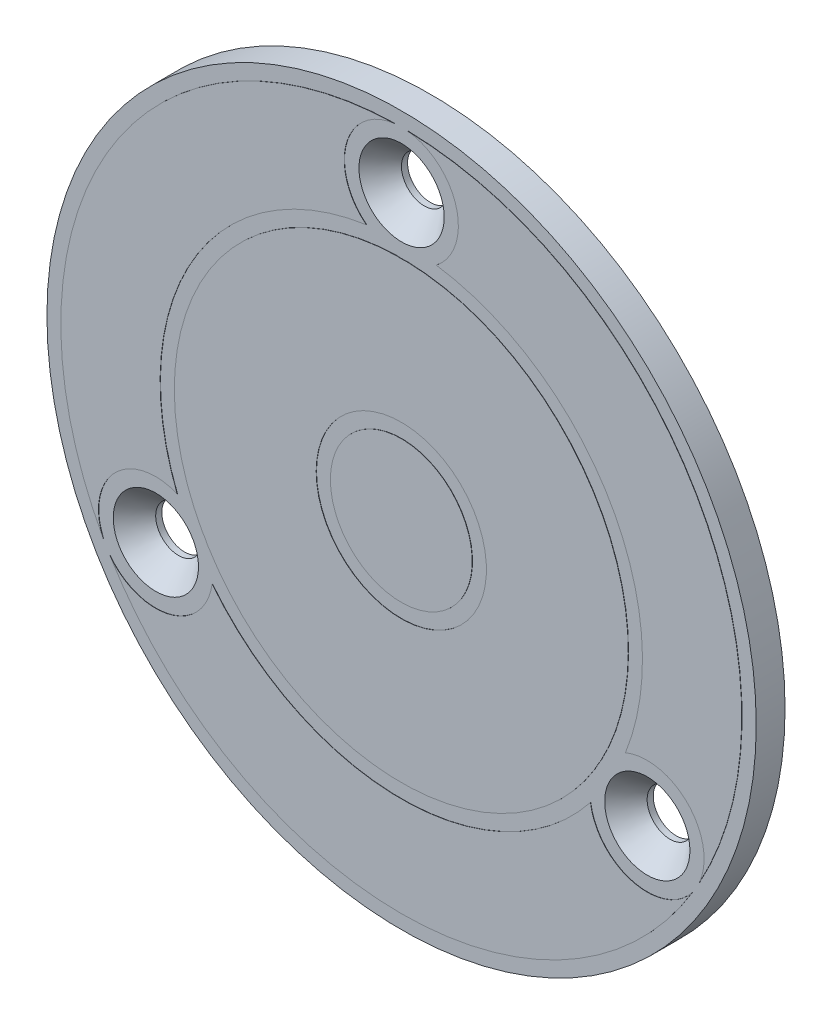
ISO-10303-21;
HEADER;
FILE_DESCRIPTION(('STEP AP214'),'2;1');
FILE_NAME('part.step','',(''),(''),'','','');
FILE_SCHEMA(('AUTOMOTIVE_DESIGN { 1 0 10303 214 1 1 1 1 }'));
ENDSEC;
DATA;
#1=APPLICATION_CONTEXT('core data for automotive mechanical design processes');
#2=APPLICATION_PROTOCOL_DEFINITION('international standard','automotive_design',2000,#1);
#3=PRODUCT_CONTEXT('',#1,'mechanical');
#4=PRODUCT('Part','Part','',(#3));
#5=PRODUCT_RELATED_PRODUCT_CATEGORY('part','',(#4));
#6=PRODUCT_DEFINITION_FORMATION('','',#4);
#7=PRODUCT_DEFINITION_CONTEXT('part definition',#1,'design');
#8=PRODUCT_DEFINITION('design','',#6,#7);
#9=PRODUCT_DEFINITION_SHAPE('','',#8);
#10=(LENGTH_UNIT() NAMED_UNIT(*) SI_UNIT(.MILLI.,.METRE.));
#11=(NAMED_UNIT(*) PLANE_ANGLE_UNIT() SI_UNIT($,.RADIAN.));
#12=(NAMED_UNIT(*) SI_UNIT($,.STERADIAN.) SOLID_ANGLE_UNIT());
#13=UNCERTAINTY_MEASURE_WITH_UNIT(LENGTH_MEASURE(1.E-05),#10,'distance_accuracy_value','');
#14=(GEOMETRIC_REPRESENTATION_CONTEXT(3) GLOBAL_UNCERTAINTY_ASSIGNED_CONTEXT((#13)) GLOBAL_UNIT_ASSIGNED_CONTEXT((#10,
#11,#12)) REPRESENTATION_CONTEXT('',''));
#15=CARTESIAN_POINT('',(0.,0.,0.));
#16=DIRECTION('',(0.,0.,1.));
#17=DIRECTION('',(1.,0.,0.));
#18=AXIS2_PLACEMENT_3D('',#15,#16,#17);
#19=CARTESIAN_POINT('',(0.,0.,1.026));
#20=DIRECTION('',(0.,0.,-1.));
#21=DIRECTION('',(-1.,0.,0.));
#22=AXIS2_PLACEMENT_3D('',#19,#20,#21);
#23=CYLINDRICAL_SURFACE('',#22,12.);
#24=CARTESIAN_POINT('',(0.,0.,1.016));
#25=DIRECTION('',(0.,0.,1.));
#26=DIRECTION('',(1.,0.,0.));
#27=AXIS2_PLACEMENT_3D('',#24,#25,#26);
#28=CIRCLE('',#27,12.);
#29=CARTESIAN_POINT('',(-10.27373582598,-6.20083479686212,1.016));
#30=VERTEX_POINT('',#29);
#31=CARTESIAN_POINT('',(10.2737358259801,-6.20083479686195,1.016));
#32=VERTEX_POINT('',#31);
#33=EDGE_CURVE('E207',#30,#32,#28,.T.);
#34=ORIENTED_EDGE('',*,*,#33,.T.);
#35=DIRECTION('',(0.,0.,1.));
#36=VECTOR('',#35,1.);
#37=CARTESIAN_POINT('',(10.27373582598,-6.20083479686203,1.021));
#38=LINE('',#37,#36);
#39=CARTESIAN_POINT('',(10.27373582598,-6.20083479686203,1.026));
#40=VERTEX_POINT('',#39);
#41=EDGE_CURVE('E200',#32,#40,#38,.T.);
#42=ORIENTED_EDGE('',*,*,#41,.T.);
#43=CARTESIAN_POINT('',(0.,0.,1.026));
#44=DIRECTION('',(0.,0.,1.));
#45=DIRECTION('',(1.,0.,0.));
#46=AXIS2_PLACEMENT_3D('',#43,#44,#45);
#47=CIRCLE('',#46,12.);
#48=CARTESIAN_POINT('',(-10.2737358259799,-6.20083479686217,1.026));
#49=VERTEX_POINT('',#48);
#50=EDGE_CURVE('E238',#49,#40,#47,.T.);
#51=ORIENTED_EDGE('',*,*,#50,.F.);
#52=DIRECTION('',(0.,0.,1.));
#53=VECTOR('',#52,1.);
#54=CARTESIAN_POINT('',(-10.2737358259799,-6.20083479686217,1.021));
#55=LINE('',#54,#53);
#56=EDGE_CURVE('E365',#49,#30,#55,.F.);
#57=ORIENTED_EDGE('',*,*,#56,.T.);
#58=EDGE_LOOP('',(#34,#42,#51,#57));
#59=FACE_BOUND('',#58,.T.);
#60=ADVANCED_FACE('F54',(#59),#23,.T.);
#61=CARTESIAN_POINT('',(0.,-27.6414213562373,1.026));
#62=DIRECTION('',(0.,0.,1.));
#63=DIRECTION('',(1.,0.,0.));
#64=AXIS2_PLACEMENT_3D('',#61,#62,#63);
#65=PLANE('',#64);
#66=CARTESIAN_POINT('',(8.66025403784443,-4.99999999999992,1.026));
#67=DIRECTION('',(0.,0.,1.));
#68=DIRECTION('',(1.,0.,0.));
#69=AXIS2_PLACEMENT_3D('',#66,#67,#68);
#70=CIRCLE('',#69,2.0113);
#71=CARTESIAN_POINT('',(6.66744622877975,-5.27211160601999,1.026));
#72=VERTEX_POINT('',#71);
#73=EDGE_CURVE('E377',#72,#40,#70,.T.);
#74=ORIENTED_EDGE('',*,*,#73,.F.);
#75=CARTESIAN_POINT('',(0.,0.,1.026));
#76=DIRECTION('',(0.,0.,1.));
#77=DIRECTION('',(1.,0.,0.));
#78=AXIS2_PLACEMENT_3D('',#75,#76,#77);
#79=CIRCLE('',#78,8.5);
#80=CARTESIAN_POINT('',(-6.66744622877968,-5.27211160602008,1.026));
#81=VERTEX_POINT('',#80);
#82=EDGE_CURVE('E224',#81,#72,#79,.T.);
#83=ORIENTED_EDGE('',*,*,#82,.F.);
#84=CARTESIAN_POINT('',(-8.66025403784437,-5.00000000000004,1.026));
#85=DIRECTION('',(0.,0.,1.));
#86=DIRECTION('',(1.,0.,0.));
#87=AXIS2_PLACEMENT_3D('',#84,#85,#86);
#88=CIRCLE('',#87,2.0113);
#89=EDGE_CURVE('E356',#49,#81,#88,.T.);
#90=ORIENTED_EDGE('',*,*,#89,.F.);
#91=ORIENTED_EDGE('',*,*,#50,.T.);
#92=EDGE_LOOP('',(#74,#83,#90,#91));
#93=FACE_BOUND('',#92,.T.);
#94=ADVANCED_FACE('F404',(#93),#65,.T.);
#95=CARTESIAN_POINT('',(0.,0.,1.026));
#96=DIRECTION('',(0.,0.,-1.));
#97=DIRECTION('',(-1.,0.,0.));
#98=AXIS2_PLACEMENT_3D('',#95,#96,#97);
#99=CYLINDRICAL_SURFACE('',#98,8.);
#100=CARTESIAN_POINT('',(0.,0.,1.016));
#101=DIRECTION('',(0.,0.,1.));
#102=DIRECTION('',(1.,0.,0.));
#103=AXIS2_PLACEMENT_3D('',#100,#101,#102);
#104=CIRCLE('',#103,8.);
#105=CARTESIAN_POINT('',(-6.8310341085416,-4.16376908676997,1.016));
#106=VERTEX_POINT('',#105);
#107=CARTESIAN_POINT('',(6.83103410854166,-4.16376908676987,1.016));
#108=VERTEX_POINT('',#107);
#109=EDGE_CURVE('E328',#106,#108,#104,.T.);
#110=ORIENTED_EDGE('',*,*,#109,.T.);
#111=DIRECTION('',(0.,0.,1.));
#112=VECTOR('',#111,1.);
#113=CARTESIAN_POINT('',(6.83103410854165,-4.16376908676989,1.021));
#114=LINE('',#113,#112);
#115=CARTESIAN_POINT('',(6.83103410854165,-4.16376908676989,1.026));
#116=VERTEX_POINT('',#115);
#117=EDGE_CURVE('E201',#108,#116,#114,.T.);
#118=ORIENTED_EDGE('',*,*,#117,.T.);
#119=CARTESIAN_POINT('',(0.,0.,1.026));
#120=DIRECTION('',(0.,0.,1.));
#121=DIRECTION('',(1.,0.,0.));
#122=AXIS2_PLACEMENT_3D('',#119,#120,#121);
#123=CIRCLE('',#122,8.);
#124=CARTESIAN_POINT('',(-6.83103410854163,-4.16376908676993,1.026));
#125=VERTEX_POINT('',#124);
#126=EDGE_CURVE('E213',#125,#116,#123,.T.);
#127=ORIENTED_EDGE('',*,*,#126,.F.);
#128=DIRECTION('',(0.,0.,1.));
#129=VECTOR('',#128,1.);
#130=CARTESIAN_POINT('',(-6.83103410854163,-4.16376908676992,1.021));
#131=LINE('',#130,#129);
#132=EDGE_CURVE('E77',#125,#106,#131,.F.);
#133=ORIENTED_EDGE('',*,*,#132,.T.);
#134=EDGE_LOOP('',(#110,#118,#127,#133));
#135=FACE_BOUND('',#134,.T.);
#136=ADVANCED_FACE('F383',(#135),#99,.T.);
#137=CARTESIAN_POINT('',(8.66025403784443,-4.99999999999992,1.026));
#138=DIRECTION('',(0.,0.,1.));
#139=DIRECTION('',(1.,0.,0.));
#140=AXIS2_PLACEMENT_3D('',#137,#138,#139);
#141=CONICAL_SURFACE('',#140,1.5113,0.715584993317674);
#142=CARTESIAN_POINT('',(8.66025403784443,-4.99999999999992,0.215162828170269));
#143=DIRECTION('',(0.,0.,1.));
#144=DIRECTION('',(1.,0.,0.));
#145=AXIS2_PLACEMENT_3D('',#142,#143,#144);
#146=CIRCLE('',#145,0.80645);
#147=CARTESIAN_POINT('',(9.46670403784443,-4.99999999999992,0.215162828170269));
#148=VERTEX_POINT('',#147);
#149=EDGE_CURVE('E290',#148,#148,#146,.T.);
#150=ORIENTED_EDGE('',*,*,#149,.F.);
#151=EDGE_LOOP('',(#150));
#152=FACE_BOUND('',#151,.T.);
#153=CARTESIAN_POINT('',(8.66025403784443,-4.99999999999992,1.016));
#154=DIRECTION('',(0.,0.,1.));
#155=DIRECTION('',(1.,0.,0.));
#156=AXIS2_PLACEMENT_3D('',#153,#154,#155);
#157=CIRCLE('',#156,1.50260713262184);
#158=CARTESIAN_POINT('',(10.1628611704663,-4.99999999999992,1.016));
#159=VERTEX_POINT('',#158);
#160=EDGE_CURVE('E296',#159,#159,#157,.T.);
#161=ORIENTED_EDGE('',*,*,#160,.T.);
#162=EDGE_LOOP('',(#161));
#163=FACE_BOUND('',#162,.T.);
#164=ADVANCED_FACE('F416',(#152,#163),#141,.F.);
#165=CARTESIAN_POINT('',(-0.233212545763079,11.9977336155,1.016));
#166=VERTEX_POINT('',#165);
#167=CARTESIAN_POINT('',(-10.506948371743,-5.79689881863798,1.016));
#168=VERTEX_POINT('',#167);
#169=EDGE_CURVE('E210',#166,#168,#28,.T.);
#170=ORIENTED_EDGE('',*,*,#169,.T.);
#171=DIRECTION('',(0.,0.,1.));
#172=VECTOR('',#171,1.);
#173=CARTESIAN_POINT('',(-10.5069483717431,-5.79689881863792,1.021));
#174=LINE('',#173,#172);
#175=CARTESIAN_POINT('',(-10.5069483717431,-5.79689881863792,1.026));
#176=VERTEX_POINT('',#175);
#177=EDGE_CURVE('E369',#168,#176,#174,.T.);
#178=ORIENTED_EDGE('',*,*,#177,.T.);
#179=CARTESIAN_POINT('',(-0.233212545763147,11.9977336155,1.026));
#180=VERTEX_POINT('',#179);
#181=EDGE_CURVE('E239',#180,#176,#47,.T.);
#182=ORIENTED_EDGE('',*,*,#181,.F.);
#183=DIRECTION('',(0.,0.,1.));
#184=VECTOR('',#183,1.);
#185=CARTESIAN_POINT('',(-0.233212545763147,11.9977336155,1.021));
#186=LINE('',#185,#184);
#187=EDGE_CURVE('E286',#180,#166,#186,.F.);
#188=ORIENTED_EDGE('',*,*,#187,.T.);
#189=EDGE_LOOP('',(#170,#178,#182,#188));
#190=FACE_BOUND('',#189,.T.);
#191=ADVANCED_FACE('F407',(#190),#23,.T.);
#192=CARTESIAN_POINT('',(-7.89950569678997,-3.13812200947999,1.026));
#193=VERTEX_POINT('',#192);
#194=EDGE_CURVE('E354',#193,#176,#88,.T.);
#195=ORIENTED_EDGE('',*,*,#194,.F.);
#196=CARTESIAN_POINT('',(-1.23205946801029,8.4102336155,1.026));
#197=VERTEX_POINT('',#196);
#198=EDGE_CURVE('E226',#197,#193,#79,.T.);
#199=ORIENTED_EDGE('',*,*,#198,.F.);
#200=CARTESIAN_POINT('',(0.,10.,1.026));
#201=DIRECTION('',(0.,0.,1.));
#202=DIRECTION('',(1.,0.,0.));
#203=AXIS2_PLACEMENT_3D('',#200,#201,#202);
#204=CIRCLE('',#203,2.0113);
#205=EDGE_CURVE('E269',#180,#197,#204,.T.);
#206=ORIENTED_EDGE('',*,*,#205,.F.);
#207=ORIENTED_EDGE('',*,*,#181,.T.);
#208=EDGE_LOOP('',(#195,#199,#206,#207));
#209=FACE_BOUND('',#208,.T.);
#210=ADVANCED_FACE('F413',(#209),#65,.T.);
#211=CARTESIAN_POINT('',(-0.190412750364309,7.9977336155,1.016));
#212=VERTEX_POINT('',#211);
#213=CARTESIAN_POINT('',(-7.0214468589059,-3.83396452873009,1.016));
#214=VERTEX_POINT('',#213);
#215=EDGE_CURVE('E326',#212,#214,#104,.T.);
#216=ORIENTED_EDGE('',*,*,#215,.T.);
#217=DIRECTION('',(0.,0.,1.));
#218=VECTOR('',#217,1.);
#219=CARTESIAN_POINT('',(-7.02144685890586,-3.83396452873014,1.021));
#220=LINE('',#219,#218);
#221=CARTESIAN_POINT('',(-7.02144685890586,-3.83396452873014,1.026));
#222=VERTEX_POINT('',#221);
#223=EDGE_CURVE('E362',#214,#222,#220,.T.);
#224=ORIENTED_EDGE('',*,*,#223,.T.);
#225=CARTESIAN_POINT('',(-0.190412750364307,7.9977336155,1.026));
#226=VERTEX_POINT('',#225);
#227=EDGE_CURVE('E208',#226,#222,#123,.T.);
#228=ORIENTED_EDGE('',*,*,#227,.F.);
#229=DIRECTION('',(0.,0.,1.));
#230=VECTOR('',#229,1.);
#231=CARTESIAN_POINT('',(-0.190412750364307,7.9977336155,1.021));
#232=LINE('',#231,#230);
#233=EDGE_CURVE('E276',#226,#212,#232,.F.);
#234=ORIENTED_EDGE('',*,*,#233,.T.);
#235=EDGE_LOOP('',(#216,#224,#228,#234));
#236=FACE_BOUND('',#235,.T.);
#237=ADVANCED_FACE('F388',(#236),#99,.T.);
#238=CARTESIAN_POINT('',(-8.66025403784437,-5.00000000000004,1.026));
#239=DIRECTION('',(0.,0.,1.));
#240=DIRECTION('',(1.,0.,0.));
#241=AXIS2_PLACEMENT_3D('',#238,#239,#240);
#242=CONICAL_SURFACE('',#241,1.5113,0.715584993317674);
#243=CARTESIAN_POINT('',(-8.66025403784437,-5.00000000000004,0.215162828170269));
#244=DIRECTION('',(0.,0.,1.));
#245=DIRECTION('',(1.,0.,0.));
#246=AXIS2_PLACEMENT_3D('',#243,#244,#245);
#247=CIRCLE('',#246,0.80645);
#248=CARTESIAN_POINT('',(-7.85380403784437,-5.00000000000004,0.215162828170269));
#249=VERTEX_POINT('',#248);
#250=EDGE_CURVE('E299',#249,#249,#247,.T.);
#251=ORIENTED_EDGE('',*,*,#250,.F.);
#252=EDGE_LOOP('',(#251));
#253=FACE_BOUND('',#252,.T.);
#254=CARTESIAN_POINT('',(-8.66025403784437,-5.00000000000004,1.016));
#255=DIRECTION('',(0.,0.,1.));
#256=DIRECTION('',(1.,0.,0.));
#257=AXIS2_PLACEMENT_3D('',#254,#255,#256);
#258=CIRCLE('',#257,1.50260713262184);
#259=CARTESIAN_POINT('',(-7.15764690522253,-5.00000000000004,1.016));
#260=VERTEX_POINT('',#259);
#261=EDGE_CURVE('E305',#260,#260,#258,.T.);
#262=ORIENTED_EDGE('',*,*,#261,.T.);
#263=EDGE_LOOP('',(#262));
#264=FACE_BOUND('',#263,.T.);
#265=ADVANCED_FACE('F577',(#253,#264),#242,.F.);
#266=CARTESIAN_POINT('',(0.,10.,1.026));
#267=DIRECTION('',(0.,0.,1.));
#268=DIRECTION('',(1.,0.,0.));
#269=AXIS2_PLACEMENT_3D('',#266,#267,#268);
#270=CONICAL_SURFACE('',#269,1.5113,0.715584993317674);
#271=CARTESIAN_POINT('',(0.,10.,0.215162828170269));
#272=DIRECTION('',(0.,0.,1.));
#273=DIRECTION('',(1.,0.,0.));
#274=AXIS2_PLACEMENT_3D('',#271,#272,#273);
#275=CIRCLE('',#274,0.80645);
#276=CARTESIAN_POINT('',(0.80645,10.,0.215162828170269));
#277=VERTEX_POINT('',#276);
#278=EDGE_CURVE('E308',#277,#277,#275,.T.);
#279=ORIENTED_EDGE('',*,*,#278,.F.);
#280=EDGE_LOOP('',(#279));
#281=FACE_BOUND('',#280,.T.);
#282=CARTESIAN_POINT('',(0.,10.,1.016));
#283=DIRECTION('',(0.,0.,1.));
#284=DIRECTION('',(1.,0.,0.));
#285=AXIS2_PLACEMENT_3D('',#282,#283,#284);
#286=CIRCLE('',#285,1.50260713262184);
#287=CARTESIAN_POINT('',(1.50260713262184,10.,1.016));
#288=VERTEX_POINT('',#287);
#289=EDGE_CURVE('E314',#288,#288,#286,.T.);
#290=ORIENTED_EDGE('',*,*,#289,.T.);
#291=EDGE_LOOP('',(#290));
#292=FACE_BOUND('',#291,.T.);
#293=ADVANCED_FACE('F432',(#281,#292),#270,.F.);
#294=CARTESIAN_POINT('',(0.,0.,1.026));
#295=DIRECTION('',(0.,0.,-1.));
#296=DIRECTION('',(-1.,0.,0.));
#297=AXIS2_PLACEMENT_3D('',#294,#295,#296);
#298=CYLINDRICAL_SURFACE('',#297,8.5);
#299=DIRECTION('',(0.,0.,1.));
#300=VECTOR('',#299,1.);
#301=CARTESIAN_POINT('',(7.89950569679002,-3.13812200947988,1.021));
#302=LINE('',#301,#300);
#303=CARTESIAN_POINT('',(7.89950569679002,-3.13812200947988,1.026));
#304=VERTEX_POINT('',#303);
#305=CARTESIAN_POINT('',(7.89950569679002,-3.13812200947988,1.016));
#306=VERTEX_POINT('',#305);
#307=EDGE_CURVE('E184',#304,#306,#302,.F.);
#308=ORIENTED_EDGE('',*,*,#307,.F.);
#309=CARTESIAN_POINT('',(1.23205946801029,8.4102336155,1.026));
#310=VERTEX_POINT('',#309);
#311=EDGE_CURVE('E219',#304,#310,#79,.T.);
#312=ORIENTED_EDGE('',*,*,#311,.T.);
#313=DIRECTION('',(0.,0.,1.));
#314=VECTOR('',#313,1.);
#315=CARTESIAN_POINT('',(1.23205946801029,8.4102336155,1.021));
#316=LINE('',#315,#314);
#317=CARTESIAN_POINT('',(1.23205946801029,8.4102336155,1.016));
#318=VERTEX_POINT('',#317);
#319=EDGE_CURVE('E270',#318,#310,#316,.T.);
#320=ORIENTED_EDGE('',*,*,#319,.F.);
#321=CARTESIAN_POINT('',(0.,0.,1.016));
#322=DIRECTION('',(0.,0.,1.));
#323=DIRECTION('',(1.,0.,0.));
#324=AXIS2_PLACEMENT_3D('',#321,#322,#323);
#325=CIRCLE('',#324,8.5);
#326=EDGE_CURVE('E62',#318,#306,#325,.F.);
#327=ORIENTED_EDGE('',*,*,#326,.T.);
#328=EDGE_LOOP('',(#308,#312,#320,#327));
#329=FACE_BOUND('',#328,.T.);
#330=ADVANCED_FACE('F424',(#329),#298,.F.);
#331=DIRECTION('',(0.,0.,1.));
#332=VECTOR('',#331,1.);
#333=CARTESIAN_POINT('',(6.66744622877975,-5.27211160601999,1.021));
#334=LINE('',#333,#332);
#335=CARTESIAN_POINT('',(6.66744622877975,-5.27211160601999,1.016));
#336=VERTEX_POINT('',#335);
#337=EDGE_CURVE('E441',#336,#72,#334,.T.);
#338=ORIENTED_EDGE('',*,*,#337,.F.);
#339=CARTESIAN_POINT('',(-6.66744622877968,-5.27211160602008,1.016));
#340=VERTEX_POINT('',#339);
#341=EDGE_CURVE('E257',#336,#340,#325,.F.);
#342=ORIENTED_EDGE('',*,*,#341,.T.);
#343=DIRECTION('',(0.,0.,1.));
#344=VECTOR('',#343,1.);
#345=CARTESIAN_POINT('',(-6.66744622877968,-5.27211160602008,1.021));
#346=LINE('',#345,#344);
#347=EDGE_CURVE('E371',#81,#340,#346,.F.);
#348=ORIENTED_EDGE('',*,*,#347,.F.);
#349=ORIENTED_EDGE('',*,*,#82,.T.);
#350=EDGE_LOOP('',(#338,#342,#348,#349));
#351=FACE_BOUND('',#350,.T.);
#352=ADVANCED_FACE('F425',(#351),#298,.F.);
#353=CARTESIAN_POINT('',(0.,0.,1.016));
#354=DIRECTION('',(0.,0.,1.));
#355=DIRECTION('',(1.,0.,0.));
#356=AXIS2_PLACEMENT_3D('',#353,#354,#355);
#357=PLANE('',#356);
#358=CARTESIAN_POINT('',(0.,0.,1.016));
#359=DIRECTION('',(0.,0.,1.));
#360=DIRECTION('',(1.,0.,0.));
#361=AXIS2_PLACEMENT_3D('',#358,#359,#360);
#362=CIRCLE('',#361,3.);
#363=CARTESIAN_POINT('',(-3.,0.,1.016));
#364=VERTEX_POINT('',#363);
#365=EDGE_CURVE('E12',#364,#364,#362,.F.);
#366=ORIENTED_EDGE('',*,*,#365,.F.);
#367=EDGE_LOOP('',(#366));
#368=FACE_BOUND('',#367,.T.);
#369=CARTESIAN_POINT('',(0.,0.,1.016));
#370=DIRECTION('',(0.,0.,1.));
#371=DIRECTION('',(1.,0.,0.));
#372=AXIS2_PLACEMENT_3D('',#369,#370,#371);
#373=CIRCLE('',#372,2.5);
#374=CARTESIAN_POINT('',(-2.5,0.,1.016));
#375=VERTEX_POINT('',#374);
#376=EDGE_CURVE('E317',#375,#375,#373,.T.);
#377=ORIENTED_EDGE('',*,*,#376,.F.);
#378=EDGE_LOOP('',(#377));
#379=FACE_BOUND('',#378,.T.);
#380=ADVANCED_FACE('F434',(#368,#379),#357,.T.);
#381=CARTESIAN_POINT('',(8.66025403784443,-4.99999999999992,1.016));
#382=DIRECTION('',(0.,0.,1.));
#383=DIRECTION('',(1.,0.,0.));
#384=AXIS2_PLACEMENT_3D('',#381,#382,#383);
#385=CIRCLE('',#384,2.0113);
#386=CARTESIAN_POINT('',(10.5069483717431,-5.79689881863786,1.016));
#387=VERTEX_POINT('',#386);
#388=EDGE_CURVE('E178',#306,#387,#385,.F.);
#389=ORIENTED_EDGE('',*,*,#388,.F.);
#390=ORIENTED_EDGE('',*,*,#326,.F.);
#391=CARTESIAN_POINT('',(0.,10.,1.016));
#392=DIRECTION('',(0.,0.,1.));
#393=DIRECTION('',(1.,0.,0.));
#394=AXIS2_PLACEMENT_3D('',#391,#392,#393);
#395=CIRCLE('',#394,2.0113);
#396=CARTESIAN_POINT('',(0.233212545763079,11.9977336155,1.016));
#397=VERTEX_POINT('',#396);
#398=EDGE_CURVE('E206',#397,#318,#395,.F.);
#399=ORIENTED_EDGE('',*,*,#398,.F.);
#400=EDGE_CURVE('E197',#387,#397,#28,.T.);
#401=ORIENTED_EDGE('',*,*,#400,.F.);
#402=EDGE_LOOP('',(#389,#390,#399,#401));
#403=FACE_BOUND('',#402,.T.);
#404=ORIENTED_EDGE('',*,*,#341,.F.);
#405=EDGE_CURVE('E192',#32,#336,#385,.F.);
#406=ORIENTED_EDGE('',*,*,#405,.F.);
#407=ORIENTED_EDGE('',*,*,#33,.F.);
#408=CARTESIAN_POINT('',(-8.66025403784437,-5.00000000000004,1.016));
#409=DIRECTION('',(0.,0.,1.));
#410=DIRECTION('',(1.,0.,0.));
#411=AXIS2_PLACEMENT_3D('',#408,#409,#410);
#412=CIRCLE('',#411,2.0113);
#413=EDGE_CURVE('E353',#340,#30,#412,.F.);
#414=ORIENTED_EDGE('',*,*,#413,.F.);
#415=EDGE_LOOP('',(#404,#406,#407,#414));
#416=FACE_BOUND('',#415,.T.);
#417=CARTESIAN_POINT('',(7.02144685890594,-3.83396452873,1.016));
#418=VERTEX_POINT('',#417);
#419=CARTESIAN_POINT('',(0.190412750364309,7.9977336155,1.016));
#420=VERTEX_POINT('',#419);
#421=EDGE_CURVE('E321',#418,#420,#104,.T.);
#422=ORIENTED_EDGE('',*,*,#421,.F.);
#423=EDGE_CURVE('E189',#108,#418,#385,.F.);
#424=ORIENTED_EDGE('',*,*,#423,.F.);
#425=ORIENTED_EDGE('',*,*,#109,.F.);
#426=EDGE_CURVE('E349',#214,#106,#412,.F.);
#427=ORIENTED_EDGE('',*,*,#426,.F.);
#428=ORIENTED_EDGE('',*,*,#215,.F.);
#429=EDGE_CURVE('E274',#420,#212,#395,.F.);
#430=ORIENTED_EDGE('',*,*,#429,.F.);
#431=EDGE_LOOP('',(#422,#424,#425,#427,#428,#430));
#432=FACE_BOUND('',#431,.T.);
#433=ORIENTED_EDGE('',*,*,#160,.F.);
#434=EDGE_LOOP('',(#433));
#435=FACE_BOUND('',#434,.T.);
#436=CARTESIAN_POINT('',(-7.89950569678998,-3.13812200947999,1.016));
#437=VERTEX_POINT('',#436);
#438=CARTESIAN_POINT('',(-1.23205946801029,8.4102336155,1.016));
#439=VERTEX_POINT('',#438);
#440=EDGE_CURVE('E256',#437,#439,#325,.F.);
#441=ORIENTED_EDGE('',*,*,#440,.F.);
#442=EDGE_CURVE('E350',#168,#437,#412,.F.);
#443=ORIENTED_EDGE('',*,*,#442,.F.);
#444=ORIENTED_EDGE('',*,*,#169,.F.);
#445=EDGE_CURVE('E268',#439,#166,#395,.F.);
#446=ORIENTED_EDGE('',*,*,#445,.F.);
#447=EDGE_LOOP('',(#441,#443,#444,#446));
#448=FACE_BOUND('',#447,.T.);
#449=ORIENTED_EDGE('',*,*,#261,.F.);
#450=EDGE_LOOP('',(#449));
#451=FACE_BOUND('',#450,.T.);
#452=ORIENTED_EDGE('',*,*,#289,.F.);
#453=EDGE_LOOP('',(#452));
#454=FACE_BOUND('',#453,.T.);
#455=CARTESIAN_POINT('',(0.,0.,1.016));
#456=DIRECTION('',(0.,0.,1.));
#457=DIRECTION('',(1.,0.,0.));
#458=AXIS2_PLACEMENT_3D('',#455,#456,#457);
#459=CIRCLE('',#458,12.5);
#460=CARTESIAN_POINT('',(12.5,0.,1.016));
#461=VERTEX_POINT('',#460);
#462=EDGE_CURVE('E251',#461,#461,#459,.T.);
#463=ORIENTED_EDGE('',*,*,#462,.T.);
#464=EDGE_LOOP('',(#463));
#465=FACE_BOUND('',#464,.T.);
#466=ADVANCED_FACE('F204',(#403,#416,#432,#435,#448,#451,#454,#465),#357,.T.);
#467=CARTESIAN_POINT('',(0.,0.,1.016));
#468=DIRECTION('',(0.,0.,-1.));
#469=DIRECTION('',(-1.,0.,0.));
#470=AXIS2_PLACEMENT_3D('',#467,#468,#469);
#471=CYLINDRICAL_SURFACE('',#470,12.5);
#472=ORIENTED_EDGE('',*,*,#462,.F.);
#473=EDGE_LOOP('',(#472));
#474=FACE_BOUND('',#473,.T.);
#475=CARTESIAN_POINT('',(0.,0.,0.));
#476=DIRECTION('',(0.,0.,1.));
#477=DIRECTION('',(1.,0.,0.));
#478=AXIS2_PLACEMENT_3D('',#475,#476,#477);
#479=CIRCLE('',#478,12.5);
#480=CARTESIAN_POINT('',(12.5,0.,0.));
#481=VERTEX_POINT('',#480);
#482=EDGE_CURVE('E245',#481,#481,#479,.T.);
#483=ORIENTED_EDGE('',*,*,#482,.T.);
#484=EDGE_LOOP('',(#483));
#485=FACE_BOUND('',#484,.T.);
#486=ADVANCED_FACE('F56',(#474,#485),#471,.T.);
#487=CARTESIAN_POINT('',(0.,0.,0.));
#488=DIRECTION('',(0.,0.,1.));
#489=DIRECTION('',(1.,0.,0.));
#490=AXIS2_PLACEMENT_3D('',#487,#488,#489);
#491=PLANE('',#490);
#492=CARTESIAN_POINT('',(8.66025403784443,-4.99999999999992,0.));
#493=DIRECTION('',(0.,0.,1.));
#494=DIRECTION('',(1.,0.,0.));
#495=AXIS2_PLACEMENT_3D('',#492,#493,#494);
#496=CIRCLE('',#495,0.80645);
#497=CARTESIAN_POINT('',(9.46670403784443,-4.99999999999992,0.));
#498=VERTEX_POINT('',#497);
#499=EDGE_CURVE('E293',#498,#498,#496,.T.);
#500=ORIENTED_EDGE('',*,*,#499,.T.);
#501=EDGE_LOOP('',(#500));
#502=FACE_BOUND('',#501,.T.);
#503=CARTESIAN_POINT('',(-8.66025403784437,-5.00000000000004,0.));
#504=DIRECTION('',(0.,0.,1.));
#505=DIRECTION('',(1.,0.,0.));
#506=AXIS2_PLACEMENT_3D('',#503,#504,#505);
#507=CIRCLE('',#506,0.80645);
#508=CARTESIAN_POINT('',(-7.85380403784437,-5.00000000000004,0.));
#509=VERTEX_POINT('',#508);
#510=EDGE_CURVE('E302',#509,#509,#507,.T.);
#511=ORIENTED_EDGE('',*,*,#510,.T.);
#512=EDGE_LOOP('',(#511));
#513=FACE_BOUND('',#512,.T.);
#514=CARTESIAN_POINT('',(0.,10.,0.));
#515=DIRECTION('',(0.,0.,1.));
#516=DIRECTION('',(1.,0.,0.));
#517=AXIS2_PLACEMENT_3D('',#514,#515,#516);
#518=CIRCLE('',#517,0.80645);
#519=CARTESIAN_POINT('',(0.80645,10.,0.));
#520=VERTEX_POINT('',#519);
#521=EDGE_CURVE('E311',#520,#520,#518,.T.);
#522=ORIENTED_EDGE('',*,*,#521,.T.);
#523=EDGE_LOOP('',(#522));
#524=FACE_BOUND('',#523,.T.);
#525=ORIENTED_EDGE('',*,*,#482,.F.);
#526=EDGE_LOOP('',(#525));
#527=FACE_BOUND('',#526,.T.);
#528=ADVANCED_FACE('F423',(#502,#513,#524,#527),#491,.F.);
#529=DIRECTION('',(0.,0.,1.));
#530=VECTOR('',#529,1.);
#531=CARTESIAN_POINT('',(-7.89950569678997,-3.13812200947999,1.021));
#532=LINE('',#531,#530);
#533=EDGE_CURVE('E262',#437,#193,#532,.T.);
#534=ORIENTED_EDGE('',*,*,#533,.F.);
#535=ORIENTED_EDGE('',*,*,#440,.T.);
#536=DIRECTION('',(0.,0.,1.));
#537=VECTOR('',#536,1.);
#538=CARTESIAN_POINT('',(-1.23205946801029,8.4102336155,1.021));
#539=LINE('',#538,#537);
#540=EDGE_CURVE('E261',#197,#439,#539,.F.);
#541=ORIENTED_EDGE('',*,*,#540,.F.);
#542=ORIENTED_EDGE('',*,*,#198,.T.);
#543=EDGE_LOOP('',(#534,#535,#541,#542));
#544=FACE_BOUND('',#543,.T.);
#545=ADVANCED_FACE('F260',(#544),#298,.F.);
#546=CARTESIAN_POINT('',(10.5069483717431,-5.79689881863777,1.026));
#547=VERTEX_POINT('',#546);
#548=CARTESIAN_POINT('',(0.233212545763147,11.9977336155,1.026));
#549=VERTEX_POINT('',#548);
#550=EDGE_CURVE('E199',#547,#549,#47,.T.);
#551=ORIENTED_EDGE('',*,*,#550,.F.);
#552=DIRECTION('',(0.,0.,1.));
#553=VECTOR('',#552,1.);
#554=CARTESIAN_POINT('',(10.5069483717431,-5.79689881863777,1.021));
#555=LINE('',#554,#553);
#556=EDGE_CURVE('E181',#547,#387,#555,.F.);
#557=ORIENTED_EDGE('',*,*,#556,.T.);
#558=ORIENTED_EDGE('',*,*,#400,.T.);
#559=DIRECTION('',(0.,0.,1.));
#560=VECTOR('',#559,1.);
#561=CARTESIAN_POINT('',(0.233212545763147,11.9977336155,1.021));
#562=LINE('',#561,#560);
#563=EDGE_CURVE('E271',#397,#549,#562,.T.);
#564=ORIENTED_EDGE('',*,*,#563,.T.);
#565=EDGE_LOOP('',(#551,#557,#558,#564));
#566=FACE_BOUND('',#565,.T.);
#567=ADVANCED_FACE('F195',(#566),#23,.T.);
#568=EDGE_CURVE('E376',#547,#304,#70,.T.);
#569=ORIENTED_EDGE('',*,*,#568,.F.);
#570=ORIENTED_EDGE('',*,*,#550,.T.);
#571=EDGE_CURVE('E279',#310,#549,#204,.T.);
#572=ORIENTED_EDGE('',*,*,#571,.F.);
#573=ORIENTED_EDGE('',*,*,#311,.F.);
#574=EDGE_LOOP('',(#569,#570,#572,#573));
#575=FACE_BOUND('',#574,.T.);
#576=ADVANCED_FACE('F375',(#575),#65,.T.);
#577=CARTESIAN_POINT('',(0.,0.,1.026));
#578=DIRECTION('',(0.,0.,-1.));
#579=DIRECTION('',(-1.,0.,0.));
#580=AXIS2_PLACEMENT_3D('',#577,#578,#579);
#581=CYLINDRICAL_SURFACE('',#580,3.);
#582=CARTESIAN_POINT('',(0.,0.,1.026));
#583=DIRECTION('',(0.,0.,1.));
#584=DIRECTION('',(1.,0.,0.));
#585=AXIS2_PLACEMENT_3D('',#582,#583,#584);
#586=CIRCLE('',#585,3.);
#587=CARTESIAN_POINT('',(-3.,0.,1.026));
#588=VERTEX_POINT('',#587);
#589=EDGE_CURVE('E324',#588,#588,#586,.T.);
#590=CARTESIAN_POINT('',(-3.,0.,1.026));
#591=CARTESIAN_POINT('',(-3.,0.,1.02589583333333));
#592=CARTESIAN_POINT('',(-3.,0.,1.02579166666667));
#593=CARTESIAN_POINT('',(-3.,0.,1.02558333333333));
#594=CARTESIAN_POINT('',(-3.,0.,1.02547916666667));
#595=CARTESIAN_POINT('',(-3.,0.,1.02527083333333));
#596=CARTESIAN_POINT('',(-3.,0.,1.02516666666667));
#597=CARTESIAN_POINT('',(-3.,0.,1.02495833333333));
#598=CARTESIAN_POINT('',(-3.,0.,1.02485416666667));
#599=CARTESIAN_POINT('',(-3.,0.,1.02464583333333));
#600=CARTESIAN_POINT('',(-3.,0.,1.02454166666667));
#601=CARTESIAN_POINT('',(-3.,0.,1.02433333333333));
#602=CARTESIAN_POINT('',(-3.,0.,1.02422916666667));
#603=CARTESIAN_POINT('',(-3.,0.,1.02402083333333));
#604=CARTESIAN_POINT('',(-3.,0.,1.02391666666667));
#605=CARTESIAN_POINT('',(-3.,0.,1.02370833333333));
#606=CARTESIAN_POINT('',(-3.,0.,1.02360416666667));
#607=CARTESIAN_POINT('',(-3.,0.,1.02339583333333));
#608=CARTESIAN_POINT('',(-3.,0.,1.02329166666667));
#609=CARTESIAN_POINT('',(-3.,0.,1.02308333333333));
#610=CARTESIAN_POINT('',(-3.,0.,1.02297916666667));
#611=CARTESIAN_POINT('',(-3.,0.,1.02277083333333));
#612=CARTESIAN_POINT('',(-3.,0.,1.02266666666667));
#613=CARTESIAN_POINT('',(-3.,0.,1.02245833333333));
#614=CARTESIAN_POINT('',(-3.,0.,1.02235416666667));
#615=CARTESIAN_POINT('',(-3.,0.,1.02214583333333));
#616=CARTESIAN_POINT('',(-3.,0.,1.02204166666667));
#617=CARTESIAN_POINT('',(-3.,0.,1.02183333333333));
#618=CARTESIAN_POINT('',(-3.,0.,1.02172916666667));
#619=CARTESIAN_POINT('',(-3.,0.,1.02152083333333));
#620=CARTESIAN_POINT('',(-3.,0.,1.02141666666667));
#621=CARTESIAN_POINT('',(-3.,0.,1.02120833333333));
#622=CARTESIAN_POINT('',(-3.,0.,1.02110416666667));
#623=CARTESIAN_POINT('',(-3.,0.,1.02089583333333));
#624=CARTESIAN_POINT('',(-3.,0.,1.02079166666667));
#625=CARTESIAN_POINT('',(-3.,0.,1.02058333333333));
#626=CARTESIAN_POINT('',(-3.,0.,1.02047916666667));
#627=CARTESIAN_POINT('',(-3.,0.,1.02027083333333));
#628=CARTESIAN_POINT('',(-3.,0.,1.02016666666667));
#629=CARTESIAN_POINT('',(-3.,0.,1.01995833333333));
#630=CARTESIAN_POINT('',(-3.,0.,1.01985416666667));
#631=CARTESIAN_POINT('',(-3.,0.,1.01964583333333));
#632=CARTESIAN_POINT('',(-3.,0.,1.01954166666667));
#633=CARTESIAN_POINT('',(-3.,0.,1.01933333333333));
#634=CARTESIAN_POINT('',(-3.,0.,1.01922916666667));
#635=CARTESIAN_POINT('',(-3.,0.,1.01902083333333));
#636=CARTESIAN_POINT('',(-3.,0.,1.01891666666667));
#637=CARTESIAN_POINT('',(-3.,0.,1.01870833333333));
#638=CARTESIAN_POINT('',(-3.,0.,1.01860416666667));
#639=CARTESIAN_POINT('',(-3.,0.,1.01839583333333));
#640=CARTESIAN_POINT('',(-3.,0.,1.01829166666667));
#641=CARTESIAN_POINT('',(-3.,0.,1.01808333333333));
#642=CARTESIAN_POINT('',(-3.,0.,1.01797916666667));
#643=CARTESIAN_POINT('',(-3.,0.,1.01777083333333));
#644=CARTESIAN_POINT('',(-3.,0.,1.01766666666667));
#645=CARTESIAN_POINT('',(-3.,0.,1.01745833333333));
#646=CARTESIAN_POINT('',(-3.,0.,1.01735416666667));
#647=CARTESIAN_POINT('',(-3.,0.,1.01714583333333));
#648=CARTESIAN_POINT('',(-3.,0.,1.01704166666667));
#649=CARTESIAN_POINT('',(-3.,0.,1.01683333333333));
#650=CARTESIAN_POINT('',(-3.,0.,1.01672916666667));
#651=CARTESIAN_POINT('',(-3.,0.,1.01652083333333));
#652=CARTESIAN_POINT('',(-3.,0.,1.01641666666667));
#653=CARTESIAN_POINT('',(-3.,0.,1.01620833333333));
#654=CARTESIAN_POINT('',(-3.,0.,1.01610416666667));
#655=CARTESIAN_POINT('',(-3.,0.,1.016));
#656=B_SPLINE_CURVE_WITH_KNOTS('',3,(#590,#591,#592,#593,#594,#595,#596,#597,#598,#599,#600,
#601,#602,#603,#604,#605,#606,#607,#608,#609,#610,#611,#612,#613,#614,#615,#616,#617,#618,#619,
#620,#621,#622,#623,#624,#625,#626,#627,#628,#629,#630,#631,#632,#633,#634,#635,#636,#637,#638,
#639,#640,#641,#642,#643,#644,#645,#646,#647,#648,#649,#650,#651,#652,#653,#654,#655),
.UNSPECIFIED.,.F.,.F.,(4,2,2,2,2,2,2,2,2,2,2,2,2,2,2,2,2,2,2,2,2,2,2,2,2,2,2,2,2,2,2,2,4),(0.,
0.000312500000000096,0.000625000000000191,0.00093750000000007,0.00125000000000017,
0.00156250000000004,0.00187500000000014,0.00218750000000002,0.00250000000000011,
0.00281250000000021,0.00312500000000009,0.00343750000000019,0.00375000000000006,
0.00406250000000016,0.00437500000000004,0.00468750000000013,0.00500000000000023,
0.00531250000000011,0.0056250000000002,0.00593750000000008,0.00625000000000018,
0.00656250000000006,0.00687500000000015,0.00718750000000003,0.00750000000000013,
0.00781250000000022,0.0081250000000001,0.0084375000000002,0.00875000000000008,
0.00906250000000017,0.00937500000000005,0.00968750000000015,0.0100000000000002),.UNSPECIFIED.);
#657=EDGE_CURVE('BSEAM422',#588,#364,#656,.T.);
#658=ORIENTED_EDGE('',*,*,#589,.T.);
#659=ORIENTED_EDGE('',*,*,#365,.T.);
#660=ORIENTED_EDGE('',*,*,#657,.T.);
#661=ORIENTED_EDGE('',*,*,#657,.F.);
#662=EDGE_LOOP('',(#658,#660,#659,#661));
#663=FACE_BOUND('',#662,.T.);
#664=ADVANCED_FACE('F422',(#663),#581,.F.);
#665=CARTESIAN_POINT('',(7.02144685890596,-3.83396452872998,1.026));
#666=VERTEX_POINT('',#665);
#667=CARTESIAN_POINT('',(0.190412750364307,7.9977336155,1.026));
#668=VERTEX_POINT('',#667);
#669=EDGE_CURVE('E215',#666,#668,#123,.T.);
#670=ORIENTED_EDGE('',*,*,#669,.F.);
#671=DIRECTION('',(0.,0.,1.));
#672=VECTOR('',#671,1.);
#673=CARTESIAN_POINT('',(7.02144685890596,-3.83396452872998,1.021));
#674=LINE('',#673,#672);
#675=EDGE_CURVE('E69',#666,#418,#674,.F.);
#676=ORIENTED_EDGE('',*,*,#675,.T.);
#677=ORIENTED_EDGE('',*,*,#421,.T.);
#678=DIRECTION('',(0.,0.,1.));
#679=VECTOR('',#678,1.);
#680=CARTESIAN_POINT('',(0.190412750364307,7.9977336155,1.021));
#681=LINE('',#680,#679);
#682=EDGE_CURVE('E283',#420,#668,#681,.T.);
#683=ORIENTED_EDGE('',*,*,#682,.T.);
#684=EDGE_LOOP('',(#670,#676,#677,#683));
#685=FACE_BOUND('',#684,.T.);
#686=ADVANCED_FACE('F337',(#685),#99,.T.);
#687=CARTESIAN_POINT('',(0.,-27.6414213562373,1.026));
#688=DIRECTION('',(0.,0.,1.));
#689=DIRECTION('',(1.,0.,0.));
#690=AXIS2_PLACEMENT_3D('',#687,#688,#689);
#691=PLANE('',#690);
#692=EDGE_CURVE('E190',#666,#116,#70,.T.);
#693=ORIENTED_EDGE('',*,*,#692,.F.);
#694=ORIENTED_EDGE('',*,*,#669,.T.);
#695=EDGE_CURVE('E345',#226,#668,#204,.T.);
#696=ORIENTED_EDGE('',*,*,#695,.F.);
#697=ORIENTED_EDGE('',*,*,#227,.T.);
#698=EDGE_CURVE('E351',#125,#222,#88,.T.);
#699=ORIENTED_EDGE('',*,*,#698,.F.);
#700=ORIENTED_EDGE('',*,*,#126,.T.);
#701=EDGE_LOOP('',(#693,#694,#696,#697,#699,#700));
#702=FACE_BOUND('',#701,.T.);
#703=ORIENTED_EDGE('',*,*,#589,.F.);
#704=EDGE_LOOP('',(#703));
#705=FACE_BOUND('',#704,.T.);
#706=ADVANCED_FACE('F385',(#702,#705),#691,.T.);
#707=CARTESIAN_POINT('',(0.,0.,1.026));
#708=DIRECTION('',(0.,0.,-1.));
#709=DIRECTION('',(-1.,0.,0.));
#710=AXIS2_PLACEMENT_3D('',#707,#708,#709);
#711=CYLINDRICAL_SURFACE('',#710,2.5);
#712=CARTESIAN_POINT('',(0.,0.,1.026));
#713=DIRECTION('',(0.,0.,1.));
#714=DIRECTION('',(1.,0.,0.));
#715=AXIS2_PLACEMENT_3D('',#712,#713,#714);
#716=CIRCLE('',#715,2.5);
#717=CARTESIAN_POINT('',(-2.5,0.,1.026));
#718=VERTEX_POINT('',#717);
#719=EDGE_CURVE('E318',#718,#718,#716,.T.);
#720=CARTESIAN_POINT('',(-2.5,0.,1.026));
#721=CARTESIAN_POINT('',(-2.5,0.,1.02589583333333));
#722=CARTESIAN_POINT('',(-2.5,0.,1.02579166666667));
#723=CARTESIAN_POINT('',(-2.5,0.,1.02558333333333));
#724=CARTESIAN_POINT('',(-2.5,0.,1.02547916666667));
#725=CARTESIAN_POINT('',(-2.5,0.,1.02527083333333));
#726=CARTESIAN_POINT('',(-2.5,0.,1.02516666666667));
#727=CARTESIAN_POINT('',(-2.5,0.,1.02495833333333));
#728=CARTESIAN_POINT('',(-2.5,0.,1.02485416666667));
#729=CARTESIAN_POINT('',(-2.5,0.,1.02464583333333));
#730=CARTESIAN_POINT('',(-2.5,0.,1.02454166666667));
#731=CARTESIAN_POINT('',(-2.5,0.,1.02433333333333));
#732=CARTESIAN_POINT('',(-2.5,0.,1.02422916666667));
#733=CARTESIAN_POINT('',(-2.5,0.,1.02402083333333));
#734=CARTESIAN_POINT('',(-2.5,0.,1.02391666666667));
#735=CARTESIAN_POINT('',(-2.5,0.,1.02370833333333));
#736=CARTESIAN_POINT('',(-2.5,0.,1.02360416666667));
#737=CARTESIAN_POINT('',(-2.5,0.,1.02339583333333));
#738=CARTESIAN_POINT('',(-2.5,0.,1.02329166666667));
#739=CARTESIAN_POINT('',(-2.5,0.,1.02308333333333));
#740=CARTESIAN_POINT('',(-2.5,0.,1.02297916666667));
#741=CARTESIAN_POINT('',(-2.5,0.,1.02277083333333));
#742=CARTESIAN_POINT('',(-2.5,0.,1.02266666666667));
#743=CARTESIAN_POINT('',(-2.5,0.,1.02245833333333));
#744=CARTESIAN_POINT('',(-2.5,0.,1.02235416666667));
#745=CARTESIAN_POINT('',(-2.5,0.,1.02214583333333));
#746=CARTESIAN_POINT('',(-2.5,0.,1.02204166666667));
#747=CARTESIAN_POINT('',(-2.5,0.,1.02183333333333));
#748=CARTESIAN_POINT('',(-2.5,0.,1.02172916666667));
#749=CARTESIAN_POINT('',(-2.5,0.,1.02152083333333));
#750=CARTESIAN_POINT('',(-2.5,0.,1.02141666666667));
#751=CARTESIAN_POINT('',(-2.5,0.,1.02120833333333));
#752=CARTESIAN_POINT('',(-2.5,0.,1.02110416666667));
#753=CARTESIAN_POINT('',(-2.5,0.,1.02089583333333));
#754=CARTESIAN_POINT('',(-2.5,0.,1.02079166666667));
#755=CARTESIAN_POINT('',(-2.5,0.,1.02058333333333));
#756=CARTESIAN_POINT('',(-2.5,0.,1.02047916666667));
#757=CARTESIAN_POINT('',(-2.5,0.,1.02027083333333));
#758=CARTESIAN_POINT('',(-2.5,0.,1.02016666666667));
#759=CARTESIAN_POINT('',(-2.5,0.,1.01995833333333));
#760=CARTESIAN_POINT('',(-2.5,0.,1.01985416666667));
#761=CARTESIAN_POINT('',(-2.5,0.,1.01964583333333));
#762=CARTESIAN_POINT('',(-2.5,0.,1.01954166666667));
#763=CARTESIAN_POINT('',(-2.5,0.,1.01933333333333));
#764=CARTESIAN_POINT('',(-2.5,0.,1.01922916666667));
#765=CARTESIAN_POINT('',(-2.5,0.,1.01902083333333));
#766=CARTESIAN_POINT('',(-2.5,0.,1.01891666666667));
#767=CARTESIAN_POINT('',(-2.5,0.,1.01870833333333));
#768=CARTESIAN_POINT('',(-2.5,0.,1.01860416666667));
#769=CARTESIAN_POINT('',(-2.5,0.,1.01839583333333));
#770=CARTESIAN_POINT('',(-2.5,0.,1.01829166666667));
#771=CARTESIAN_POINT('',(-2.5,0.,1.01808333333333));
#772=CARTESIAN_POINT('',(-2.5,0.,1.01797916666667));
#773=CARTESIAN_POINT('',(-2.5,0.,1.01777083333333));
#774=CARTESIAN_POINT('',(-2.5,0.,1.01766666666667));
#775=CARTESIAN_POINT('',(-2.5,0.,1.01745833333333));
#776=CARTESIAN_POINT('',(-2.5,0.,1.01735416666667));
#777=CARTESIAN_POINT('',(-2.5,0.,1.01714583333333));
#778=CARTESIAN_POINT('',(-2.5,0.,1.01704166666667));
#779=CARTESIAN_POINT('',(-2.5,0.,1.01683333333333));
#780=CARTESIAN_POINT('',(-2.5,0.,1.01672916666667));
#781=CARTESIAN_POINT('',(-2.5,0.,1.01652083333333));
#782=CARTESIAN_POINT('',(-2.5,0.,1.01641666666667));
#783=CARTESIAN_POINT('',(-2.5,0.,1.01620833333333));
#784=CARTESIAN_POINT('',(-2.5,0.,1.01610416666667));
#785=CARTESIAN_POINT('',(-2.5,0.,1.016));
#786=B_SPLINE_CURVE_WITH_KNOTS('',3,(#720,#721,#722,#723,#724,#725,#726,#727,#728,#729,#730,
#731,#732,#733,#734,#735,#736,#737,#738,#739,#740,#741,#742,#743,#744,#745,#746,#747,#748,#749,
#750,#751,#752,#753,#754,#755,#756,#757,#758,#759,#760,#761,#762,#763,#764,#765,#766,#767,#768,
#769,#770,#771,#772,#773,#774,#775,#776,#777,#778,#779,#780,#781,#782,#783,#784,#785),
.UNSPECIFIED.,.F.,.F.,(4,2,2,2,2,2,2,2,2,2,2,2,2,2,2,2,2,2,2,2,2,2,2,2,2,2,2,2,2,2,2,2,4),(0.,
0.000312499999999879,0.000624999999999975,0.000937499999999853,0.00124999999999995,
0.00156249999999983,0.00187499999999992,0.0021874999999998,0.0024999999999999,
0.00281249999999999,0.00312499999999987,0.00343749999999997,0.00374999999999985,
0.00406249999999994,0.00437499999999982,0.00468749999999992,0.00500000000000001,
0.00531249999999989,0.00562499999999999,0.00593749999999987,0.00624999999999996,
0.00656249999999984,0.00687499999999994,0.00718749999999982,0.00749999999999991,
0.00781250000000001,0.00812499999999989,0.00843749999999998,0.00874999999999986,
0.00906249999999996,0.00937499999999983,0.00968749999999993,0.01),.UNSPECIFIED.);
#787=EDGE_CURVE('BSEAM520',#718,#375,#786,.T.);
#788=ORIENTED_EDGE('',*,*,#719,.F.);
#789=ORIENTED_EDGE('',*,*,#376,.T.);
#790=ORIENTED_EDGE('',*,*,#787,.T.);
#791=ORIENTED_EDGE('',*,*,#787,.F.);
#792=EDGE_LOOP('',(#788,#790,#789,#791));
#793=FACE_BOUND('',#792,.T.);
#794=ADVANCED_FACE('F520',(#793),#711,.T.);
#795=CARTESIAN_POINT('',(0.,-27.6414213562373,1.026));
#796=DIRECTION('',(0.,0.,1.));
#797=DIRECTION('',(1.,0.,0.));
#798=AXIS2_PLACEMENT_3D('',#795,#796,#797);
#799=PLANE('',#798);
#800=ORIENTED_EDGE('',*,*,#719,.T.);
#801=EDGE_LOOP('',(#800));
#802=FACE_BOUND('',#801,.T.);
#803=ADVANCED_FACE('F665',(#802),#799,.T.);
#804=CARTESIAN_POINT('',(0.,10.,1.026));
#805=DIRECTION('',(0.,0.,1.));
#806=DIRECTION('',(1.,0.,0.));
#807=AXIS2_PLACEMENT_3D('',#804,#805,#806);
#808=CYLINDRICAL_SURFACE('',#807,0.80645);
#809=ORIENTED_EDGE('',*,*,#521,.F.);
#810=EDGE_LOOP('',(#809));
#811=FACE_BOUND('',#810,.T.);
#812=ORIENTED_EDGE('',*,*,#278,.T.);
#813=EDGE_LOOP('',(#812));
#814=FACE_BOUND('',#813,.T.);
#815=ADVANCED_FACE('F649',(#811,#814),#808,.F.);
#816=CARTESIAN_POINT('',(-8.66025403784437,-5.00000000000004,1.026));
#817=DIRECTION('',(0.,0.,1.));
#818=DIRECTION('',(1.,0.,0.));
#819=AXIS2_PLACEMENT_3D('',#816,#817,#818);
#820=CYLINDRICAL_SURFACE('',#819,0.80645);
#821=ORIENTED_EDGE('',*,*,#510,.F.);
#822=EDGE_LOOP('',(#821));
#823=FACE_BOUND('',#822,.T.);
#824=ORIENTED_EDGE('',*,*,#250,.T.);
#825=EDGE_LOOP('',(#824));
#826=FACE_BOUND('',#825,.T.);
#827=ADVANCED_FACE('F640',(#823,#826),#820,.F.);
#828=CARTESIAN_POINT('',(8.66025403784443,-4.99999999999992,1.026));
#829=DIRECTION('',(0.,0.,1.));
#830=DIRECTION('',(1.,0.,0.));
#831=AXIS2_PLACEMENT_3D('',#828,#829,#830);
#832=CYLINDRICAL_SURFACE('',#831,0.80645);
#833=ORIENTED_EDGE('',*,*,#499,.F.);
#834=EDGE_LOOP('',(#833));
#835=FACE_BOUND('',#834,.T.);
#836=ORIENTED_EDGE('',*,*,#149,.T.);
#837=EDGE_LOOP('',(#836));
#838=FACE_BOUND('',#837,.T.);
#839=ADVANCED_FACE('F510',(#835,#838),#832,.F.);
#840=CARTESIAN_POINT('',(0.,10.,-4.67281547600201));
#841=DIRECTION('',(0.,0.,1.));
#842=DIRECTION('',(1.,0.,0.));
#843=AXIS2_PLACEMENT_3D('',#840,#841,#842);
#844=CYLINDRICAL_SURFACE('',#843,2.0113);
#845=ORIENTED_EDGE('',*,*,#319,.T.);
#846=ORIENTED_EDGE('',*,*,#571,.T.);
#847=ORIENTED_EDGE('',*,*,#563,.F.);
#848=ORIENTED_EDGE('',*,*,#398,.T.);
#849=EDGE_LOOP('',(#845,#846,#847,#848));
#850=FACE_BOUND('',#849,.T.);
#851=ADVANCED_FACE('F374',(#850),#844,.F.);
#852=ORIENTED_EDGE('',*,*,#540,.T.);
#853=ORIENTED_EDGE('',*,*,#445,.T.);
#854=ORIENTED_EDGE('',*,*,#187,.F.);
#855=ORIENTED_EDGE('',*,*,#205,.T.);
#856=EDGE_LOOP('',(#852,#853,#854,#855));
#857=FACE_BOUND('',#856,.T.);
#858=ADVANCED_FACE('F267',(#857),#844,.F.);
#859=ORIENTED_EDGE('',*,*,#429,.T.);
#860=ORIENTED_EDGE('',*,*,#233,.F.);
#861=ORIENTED_EDGE('',*,*,#695,.T.);
#862=ORIENTED_EDGE('',*,*,#682,.F.);
#863=EDGE_LOOP('',(#859,#860,#861,#862));
#864=FACE_BOUND('',#863,.T.);
#865=ADVANCED_FACE('F343',(#864),#844,.F.);
#866=CARTESIAN_POINT('',(-8.66025403784437,-5.00000000000004,-4.67281547600201));
#867=DIRECTION('',(0.,0.,1.));
#868=DIRECTION('',(1.,0.,0.));
#869=AXIS2_PLACEMENT_3D('',#866,#867,#868);
#870=CYLINDRICAL_SURFACE('',#869,2.0113);
#871=ORIENTED_EDGE('',*,*,#347,.T.);
#872=ORIENTED_EDGE('',*,*,#413,.T.);
#873=ORIENTED_EDGE('',*,*,#56,.F.);
#874=ORIENTED_EDGE('',*,*,#89,.T.);
#875=EDGE_LOOP('',(#871,#872,#873,#874));
#876=FACE_BOUND('',#875,.T.);
#877=ADVANCED_FACE('F393',(#876),#870,.F.);
#878=ORIENTED_EDGE('',*,*,#533,.T.);
#879=ORIENTED_EDGE('',*,*,#194,.T.);
#880=ORIENTED_EDGE('',*,*,#177,.F.);
#881=ORIENTED_EDGE('',*,*,#442,.T.);
#882=EDGE_LOOP('',(#878,#879,#880,#881));
#883=FACE_BOUND('',#882,.T.);
#884=ADVANCED_FACE('F391',(#883),#870,.F.);
#885=ORIENTED_EDGE('',*,*,#426,.T.);
#886=ORIENTED_EDGE('',*,*,#132,.F.);
#887=ORIENTED_EDGE('',*,*,#698,.T.);
#888=ORIENTED_EDGE('',*,*,#223,.F.);
#889=EDGE_LOOP('',(#885,#886,#887,#888));
#890=FACE_BOUND('',#889,.T.);
#891=ADVANCED_FACE('F389',(#890),#870,.F.);
#892=CARTESIAN_POINT('',(8.66025403784443,-4.99999999999992,-4.67281547600201));
#893=DIRECTION('',(0.,0.,1.));
#894=DIRECTION('',(1.,0.,0.));
#895=AXIS2_PLACEMENT_3D('',#892,#893,#894);
#896=CYLINDRICAL_SURFACE('',#895,2.0113);
#897=ORIENTED_EDGE('',*,*,#307,.T.);
#898=ORIENTED_EDGE('',*,*,#388,.T.);
#899=ORIENTED_EDGE('',*,*,#556,.F.);
#900=ORIENTED_EDGE('',*,*,#568,.T.);
#901=EDGE_LOOP('',(#897,#898,#899,#900));
#902=FACE_BOUND('',#901,.T.);
#903=ADVANCED_FACE('F180',(#902),#896,.F.);
#904=ORIENTED_EDGE('',*,*,#337,.T.);
#905=ORIENTED_EDGE('',*,*,#73,.T.);
#906=ORIENTED_EDGE('',*,*,#41,.F.);
#907=ORIENTED_EDGE('',*,*,#405,.T.);
#908=EDGE_LOOP('',(#904,#905,#906,#907));
#909=FACE_BOUND('',#908,.T.);
#910=ADVANCED_FACE('F398',(#909),#896,.F.);
#911=ORIENTED_EDGE('',*,*,#423,.T.);
#912=ORIENTED_EDGE('',*,*,#675,.F.);
#913=ORIENTED_EDGE('',*,*,#692,.T.);
#914=ORIENTED_EDGE('',*,*,#117,.F.);
#915=EDGE_LOOP('',(#911,#912,#913,#914));
#916=FACE_BOUND('',#915,.T.);
#917=ADVANCED_FACE('F380',(#916),#896,.F.);
#918=CLOSED_SHELL('',(#60,#94,#136,#164,#191,#210,#237,#265,#293,#330,#352,#380,#466,#486,#528,
#545,#567,#576,#664,#686,#706,#794,#803,#815,#827,#839,#851,#858,#865,#877,#884,#891,#903,#910,#917));
#919=MANIFOLD_SOLID_BREP('B2',#918);
#920=ADVANCED_BREP_SHAPE_REPRESENTATION('',(#18,#919),#14);
#921=SHAPE_DEFINITION_REPRESENTATION(#9,#920);
ENDSEC;
END-ISO-10303-21;
